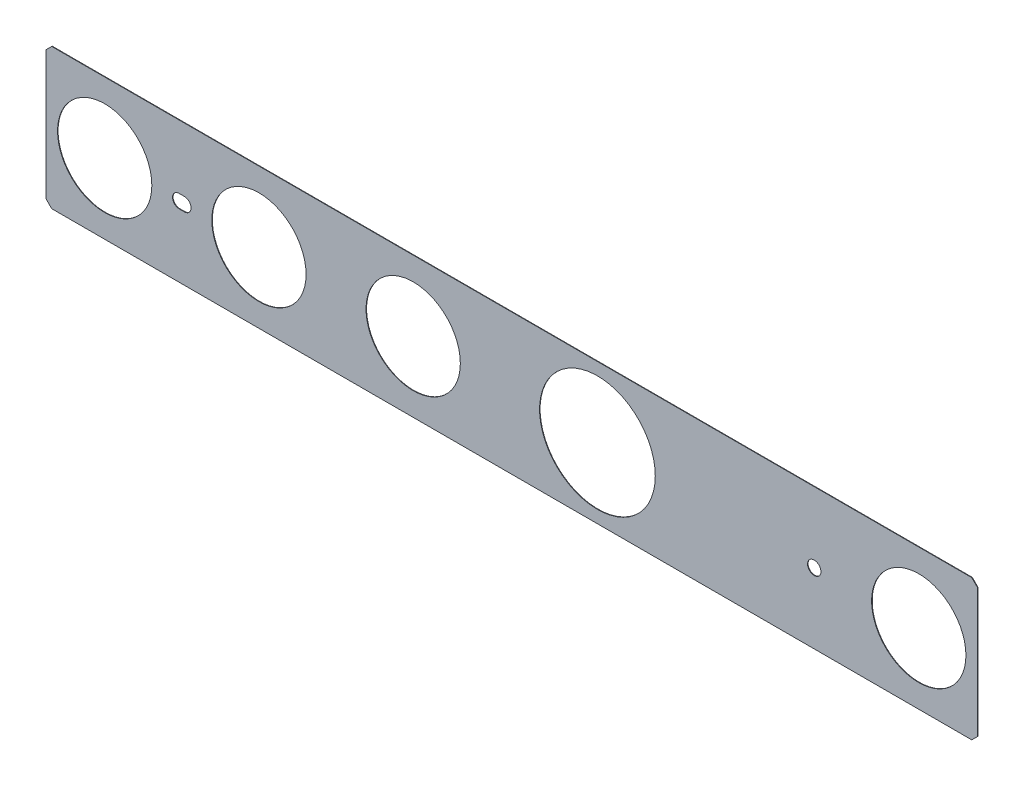
ISO-10303-21;
HEADER;
FILE_DESCRIPTION(('STEP AP214'),'2;1');
FILE_NAME('part.step','',(''),(''),'','','');
FILE_SCHEMA(('AUTOMOTIVE_DESIGN { 1 0 10303 214 1 1 1 1 }'));
ENDSEC;
DATA;
#1=APPLICATION_CONTEXT('core data for automotive mechanical design processes');
#2=APPLICATION_PROTOCOL_DEFINITION('international standard','automotive_design',2000,#1);
#3=PRODUCT_CONTEXT('',#1,'mechanical');
#4=PRODUCT('Part','Part','',(#3));
#5=PRODUCT_RELATED_PRODUCT_CATEGORY('part','',(#4));
#6=PRODUCT_DEFINITION_FORMATION('','',#4);
#7=PRODUCT_DEFINITION_CONTEXT('part definition',#1,'design');
#8=PRODUCT_DEFINITION('design','',#6,#7);
#9=PRODUCT_DEFINITION_SHAPE('','',#8);
#10=(LENGTH_UNIT() NAMED_UNIT(*) SI_UNIT(.MILLI.,.METRE.));
#11=(NAMED_UNIT(*) PLANE_ANGLE_UNIT() SI_UNIT($,.RADIAN.));
#12=(NAMED_UNIT(*) SI_UNIT($,.STERADIAN.) SOLID_ANGLE_UNIT());
#13=UNCERTAINTY_MEASURE_WITH_UNIT(LENGTH_MEASURE(1.E-05),#10,'distance_accuracy_value','');
#14=(GEOMETRIC_REPRESENTATION_CONTEXT(3) GLOBAL_UNCERTAINTY_ASSIGNED_CONTEXT((#13)) GLOBAL_UNIT_ASSIGNED_CONTEXT((#10,
#11,#12)) REPRESENTATION_CONTEXT('',''));
#15=CARTESIAN_POINT('',(0.,0.,0.));
#16=DIRECTION('',(0.,0.,1.));
#17=DIRECTION('',(1.,0.,0.));
#18=AXIS2_PLACEMENT_3D('',#15,#16,#17);
#19=CARTESIAN_POINT('',(0.,0.,-2.47));
#20=DIRECTION('',(0.,0.,1.));
#21=DIRECTION('',(1.,0.,0.));
#22=AXIS2_PLACEMENT_3D('',#19,#20,#21);
#23=PLANE('',#22);
#24=DIRECTION('',(1.,0.,0.));
#25=VECTOR('',#24,1.);
#26=CARTESIAN_POINT('',(-38.8,-0.78,-2.47));
#27=LINE('',#26,#25);
#28=CARTESIAN_POINT('',(-38.8,-0.78,-2.47));
#29=VERTEX_POINT('',#28);
#30=CARTESIAN_POINT('',(-38.2,-0.78,-2.47));
#31=VERTEX_POINT('',#30);
#32=EDGE_CURVE('E127',#29,#31,#27,.T.);
#33=ORIENTED_EDGE('',*,*,#32,.T.);
#34=CARTESIAN_POINT('',(-38.2,0.,-2.47));
#35=DIRECTION('',(0.,0.,1.));
#36=DIRECTION('',(1.,0.,0.));
#37=AXIS2_PLACEMENT_3D('',#34,#35,#36);
#38=CIRCLE('',#37,0.78);
#39=CARTESIAN_POINT('',(-38.2,0.78,-2.47));
#40=VERTEX_POINT('',#39);
#41=EDGE_CURVE('E59',#31,#40,#38,.T.);
#42=ORIENTED_EDGE('',*,*,#41,.T.);
#43=DIRECTION('',(1.,0.,0.));
#44=VECTOR('',#43,1.);
#45=CARTESIAN_POINT('',(-38.2,0.78,-2.47));
#46=LINE('',#45,#44);
#47=CARTESIAN_POINT('',(-38.8,0.78,-2.47));
#48=VERTEX_POINT('',#47);
#49=EDGE_CURVE('E124',#40,#48,#46,.F.);
#50=ORIENTED_EDGE('',*,*,#49,.T.);
#51=CARTESIAN_POINT('',(-38.8,0.,-2.47));
#52=DIRECTION('',(0.,0.,1.));
#53=DIRECTION('',(1.,0.,0.));
#54=AXIS2_PLACEMENT_3D('',#51,#52,#53);
#55=CIRCLE('',#54,0.78);
#56=EDGE_CURVE('E153',#48,#29,#55,.T.);
#57=ORIENTED_EDGE('',*,*,#56,.T.);
#58=EDGE_LOOP('',(#33,#42,#50,#57));
#59=FACE_BOUND('',#58,.T.);
#60=CARTESIAN_POINT('',(35.3,0.,-2.47));
#61=DIRECTION('',(0.,0.,1.));
#62=DIRECTION('',(1.,0.,0.));
#63=AXIS2_PLACEMENT_3D('',#60,#61,#62);
#64=CIRCLE('',#63,0.78);
#65=CARTESIAN_POINT('',(36.08,0.,-2.47));
#66=VERTEX_POINT('',#65);
#67=EDGE_CURVE('E126',#66,#66,#64,.T.);
#68=ORIENTED_EDGE('',*,*,#67,.T.);
#69=EDGE_LOOP('',(#68));
#70=FACE_BOUND('',#69,.T.);
#71=CARTESIAN_POINT('',(47.5,0.,-2.47));
#72=DIRECTION('',(0.,0.,1.));
#73=DIRECTION('',(1.,0.,0.));
#74=AXIS2_PLACEMENT_3D('',#71,#72,#73);
#75=CIRCLE('',#74,5.5);
#76=CARTESIAN_POINT('',(53.,0.,-2.47));
#77=VERTEX_POINT('',#76);
#78=EDGE_CURVE('E158',#77,#77,#75,.T.);
#79=ORIENTED_EDGE('',*,*,#78,.T.);
#80=EDGE_LOOP('',(#79));
#81=FACE_BOUND('',#80,.T.);
#82=CARTESIAN_POINT('',(-47.5,0.,-2.47));
#83=DIRECTION('',(0.,0.,1.));
#84=DIRECTION('',(1.,0.,0.));
#85=AXIS2_PLACEMENT_3D('',#82,#83,#84);
#86=CIRCLE('',#85,5.5);
#87=CARTESIAN_POINT('',(-42.,0.,-2.47));
#88=VERTEX_POINT('',#87);
#89=EDGE_CURVE('E161',#88,#88,#86,.T.);
#90=ORIENTED_EDGE('',*,*,#89,.T.);
#91=EDGE_LOOP('',(#90));
#92=FACE_BOUND('',#91,.T.);
#93=CARTESIAN_POINT('',(-11.5,0.,-2.47));
#94=DIRECTION('',(0.,0.,1.));
#95=DIRECTION('',(1.,0.,0.));
#96=AXIS2_PLACEMENT_3D('',#93,#94,#95);
#97=CIRCLE('',#96,5.5);
#98=CARTESIAN_POINT('',(-6.,0.,-2.47));
#99=VERTEX_POINT('',#98);
#100=EDGE_CURVE('E164',#99,#99,#97,.T.);
#101=ORIENTED_EDGE('',*,*,#100,.T.);
#102=EDGE_LOOP('',(#101));
#103=FACE_BOUND('',#102,.T.);
#104=CARTESIAN_POINT('',(10.,0.,-2.47));
#105=DIRECTION('',(0.,0.,1.));
#106=DIRECTION('',(1.,0.,0.));
#107=AXIS2_PLACEMENT_3D('',#104,#105,#106);
#108=CIRCLE('',#107,6.75);
#109=CARTESIAN_POINT('',(16.75,0.,-2.47));
#110=VERTEX_POINT('',#109);
#111=EDGE_CURVE('E166',#110,#110,#108,.T.);
#112=ORIENTED_EDGE('',*,*,#111,.T.);
#113=EDGE_LOOP('',(#112));
#114=FACE_BOUND('',#113,.T.);
#115=CARTESIAN_POINT('',(-29.5,0.,-2.47));
#116=DIRECTION('',(0.,0.,1.));
#117=DIRECTION('',(1.,0.,0.));
#118=AXIS2_PLACEMENT_3D('',#115,#116,#117);
#119=CIRCLE('',#118,5.5);
#120=CARTESIAN_POINT('',(-24.,0.,-2.47));
#121=VERTEX_POINT('',#120);
#122=EDGE_CURVE('E20',#121,#121,#119,.T.);
#123=ORIENTED_EDGE('',*,*,#122,.T.);
#124=EDGE_LOOP('',(#123));
#125=FACE_BOUND('',#124,.T.);
#126=DIRECTION('',(0.,1.,0.));
#127=VECTOR('',#126,1.);
#128=CARTESIAN_POINT('',(54.35,-7.532893218813,-2.47));
#129=LINE('',#128,#127);
#130=CARTESIAN_POINT('',(54.3499999999993,-7.53289321881225,-2.47));
#131=VERTEX_POINT('',#130);
#132=CARTESIAN_POINT('',(54.3500000000001,7.53289321881213,-2.47));
#133=VERTEX_POINT('',#132);
#134=EDGE_CURVE('E186',#131,#133,#129,.T.);
#135=ORIENTED_EDGE('',*,*,#134,.F.);
#136=DIRECTION('',(0.707106781186548,0.707106781186548,0.));
#137=VECTOR('',#136,1.);
#138=CARTESIAN_POINT('',(53.68289321881,-8.2,-2.47));
#139=LINE('',#138,#137);
#140=CARTESIAN_POINT('',(53.68289321881,-8.2,-2.47));
#141=VERTEX_POINT('',#140);
#142=EDGE_CURVE('E191',#141,#131,#139,.T.);
#143=ORIENTED_EDGE('',*,*,#142,.F.);
#144=DIRECTION('',(1.,0.,0.));
#145=VECTOR('',#144,1.);
#146=CARTESIAN_POINT('',(-53.68289321881,-8.2,-2.47));
#147=LINE('',#146,#145);
#148=CARTESIAN_POINT('',(-53.6828932188107,-8.20000000000075,-2.47));
#149=VERTEX_POINT('',#148);
#150=EDGE_CURVE('E196',#149,#141,#147,.T.);
#151=ORIENTED_EDGE('',*,*,#150,.F.);
#152=DIRECTION('',(0.707106781186548,-0.707106781186548,0.));
#153=VECTOR('',#152,1.);
#154=CARTESIAN_POINT('',(-54.35,-7.532893218813,-2.47));
#155=LINE('',#154,#153);
#156=CARTESIAN_POINT('',(-54.3500000000001,-7.53289321881213,-2.47));
#157=VERTEX_POINT('',#156);
#158=EDGE_CURVE('E111',#157,#149,#155,.T.);
#159=ORIENTED_EDGE('',*,*,#158,.F.);
#160=DIRECTION('',(0.,1.,0.));
#161=VECTOR('',#160,1.);
#162=CARTESIAN_POINT('',(-54.35,7.532893218813,-2.47));
#163=LINE('',#162,#161);
#164=CARTESIAN_POINT('',(-54.3499999999993,7.53289321881225,-2.47));
#165=VERTEX_POINT('',#164);
#166=EDGE_CURVE('E108',#165,#157,#163,.F.);
#167=ORIENTED_EDGE('',*,*,#166,.F.);
#168=DIRECTION('',(-0.707106781186548,-0.707106781186548,0.));
#169=VECTOR('',#168,1.);
#170=CARTESIAN_POINT('',(-53.68289321881,8.2,-2.47));
#171=LINE('',#170,#169);
#172=CARTESIAN_POINT('',(-53.68289321881,8.2,-2.47));
#173=VERTEX_POINT('',#172);
#174=EDGE_CURVE('E95',#173,#165,#171,.T.);
#175=ORIENTED_EDGE('',*,*,#174,.F.);
#176=DIRECTION('',(1.,0.,0.));
#177=VECTOR('',#176,1.);
#178=CARTESIAN_POINT('',(53.68289321881,8.2,-2.47));
#179=LINE('',#178,#177);
#180=CARTESIAN_POINT('',(53.6828932188108,8.20000000000075,-2.47));
#181=VERTEX_POINT('',#180);
#182=EDGE_CURVE('E171',#181,#173,#179,.F.);
#183=ORIENTED_EDGE('',*,*,#182,.F.);
#184=DIRECTION('',(-0.707106781186548,0.707106781186548,0.));
#185=VECTOR('',#184,1.);
#186=CARTESIAN_POINT('',(54.35,7.532893218813,-2.47));
#187=LINE('',#186,#185);
#188=EDGE_CURVE('E68',#133,#181,#187,.T.);
#189=ORIENTED_EDGE('',*,*,#188,.F.);
#190=EDGE_LOOP('',(#135,#143,#151,#159,#167,#175,#183,#189));
#191=FACE_BOUND('',#190,.T.);
#192=ADVANCED_FACE('F17',(#59,#70,#81,#92,#103,#114,#125,#191),#23,.F.);
#193=CARTESIAN_POINT('',(-53.68289321881,8.2,-2.47));
#194=DIRECTION('',(-0.707106781186548,0.707106781186548,0.));
#195=DIRECTION('',(-0.707106781186548,-0.707106781186548,0.));
#196=AXIS2_PLACEMENT_3D('',#193,#194,#195);
#197=PLANE('',#196);
#198=DIRECTION('',(0.,0.,1.));
#199=VECTOR('',#198,1.);
#200=CARTESIAN_POINT('',(-53.68289321881,8.2,-2.47));
#201=LINE('',#200,#199);
#202=CARTESIAN_POINT('',(-53.68289321881,8.2,-2.41));
#203=VERTEX_POINT('',#202);
#204=EDGE_CURVE('E103',#173,#203,#201,.T.);
#205=ORIENTED_EDGE('',*,*,#204,.F.);
#206=ORIENTED_EDGE('',*,*,#174,.T.);
#207=DIRECTION('',(0.,0.,1.));
#208=VECTOR('',#207,1.);
#209=CARTESIAN_POINT('',(-54.35,7.532893218813,-2.47));
#210=LINE('',#209,#208);
#211=CARTESIAN_POINT('',(-54.3499999999993,7.53289321881225,-2.41));
#212=VERTEX_POINT('',#211);
#213=EDGE_CURVE('E100',#212,#165,#210,.F.);
#214=ORIENTED_EDGE('',*,*,#213,.F.);
#215=DIRECTION('',(-0.707106781188139,-0.707106781184956,0.));
#216=VECTOR('',#215,1.);
#217=CARTESIAN_POINT('',(-53.68289321881,8.2,-2.41));
#218=LINE('',#217,#216);
#219=EDGE_CURVE('E213',#203,#212,#218,.T.);
#220=ORIENTED_EDGE('',*,*,#219,.F.);
#221=EDGE_LOOP('',(#205,#206,#214,#220));
#222=FACE_BOUND('',#221,.T.);
#223=ADVANCED_FACE('F97',(#222),#197,.T.);
#224=CARTESIAN_POINT('',(-54.35,7.532893218813,-2.47));
#225=DIRECTION('',(-1.,0.,0.));
#226=DIRECTION('',(0.,0.,1.));
#227=AXIS2_PLACEMENT_3D('',#224,#225,#226);
#228=PLANE('',#227);
#229=ORIENTED_EDGE('',*,*,#213,.T.);
#230=ORIENTED_EDGE('',*,*,#166,.T.);
#231=DIRECTION('',(0.,0.,1.));
#232=VECTOR('',#231,1.);
#233=CARTESIAN_POINT('',(-54.3500000000005,-7.5328932188125,-2.47));
#234=LINE('',#233,#232);
#235=CARTESIAN_POINT('',(-54.3500000000001,-7.53289321881213,-2.41));
#236=VERTEX_POINT('',#235);
#237=EDGE_CURVE('E115',#236,#157,#234,.F.);
#238=ORIENTED_EDGE('',*,*,#237,.F.);
#239=DIRECTION('',(0.,1.,0.));
#240=VECTOR('',#239,1.);
#241=CARTESIAN_POINT('',(-54.35,0.,-2.41));
#242=LINE('',#241,#240);
#243=EDGE_CURVE('E119',#212,#236,#242,.F.);
#244=ORIENTED_EDGE('',*,*,#243,.F.);
#245=EDGE_LOOP('',(#229,#230,#238,#244));
#246=FACE_BOUND('',#245,.T.);
#247=ADVANCED_FACE('F117',(#246),#228,.T.);
#248=CARTESIAN_POINT('',(-54.35,-7.532893218813,-2.47));
#249=DIRECTION('',(-0.707106781186548,-0.707106781186548,0.));
#250=DIRECTION('',(0.707106781186548,-0.707106781186548,0.));
#251=AXIS2_PLACEMENT_3D('',#248,#249,#250);
#252=PLANE('',#251);
#253=ORIENTED_EDGE('',*,*,#237,.T.);
#254=ORIENTED_EDGE('',*,*,#158,.T.);
#255=DIRECTION('',(0.,0.,-1.));
#256=VECTOR('',#255,1.);
#257=CARTESIAN_POINT('',(-53.68289321881,-8.2,-2.47));
#258=LINE('',#257,#256);
#259=CARTESIAN_POINT('',(-53.6828932188107,-8.20000000000075,-2.41));
#260=VERTEX_POINT('',#259);
#261=EDGE_CURVE('E198',#260,#149,#258,.T.);
#262=ORIENTED_EDGE('',*,*,#261,.F.);
#263=DIRECTION('',(0.707106781187609,-0.707106781185486,0.));
#264=VECTOR('',#263,1.);
#265=CARTESIAN_POINT('',(-54.35,-7.532893218812,-2.41));
#266=LINE('',#265,#264);
#267=EDGE_CURVE('E207',#236,#260,#266,.T.);
#268=ORIENTED_EDGE('',*,*,#267,.F.);
#269=EDGE_LOOP('',(#253,#254,#262,#268));
#270=FACE_BOUND('',#269,.T.);
#271=ADVANCED_FACE('F203',(#270),#252,.T.);
#272=CARTESIAN_POINT('',(-53.68289321881,-8.2,-2.47));
#273=DIRECTION('',(0.,-1.,0.));
#274=DIRECTION('',(0.,0.,-1.));
#275=AXIS2_PLACEMENT_3D('',#272,#273,#274);
#276=PLANE('',#275);
#277=ORIENTED_EDGE('',*,*,#261,.T.);
#278=ORIENTED_EDGE('',*,*,#150,.T.);
#279=DIRECTION('',(0.,0.,1.));
#280=VECTOR('',#279,1.);
#281=CARTESIAN_POINT('',(53.68289321881,-8.2,-2.47));
#282=LINE('',#281,#280);
#283=CARTESIAN_POINT('',(53.68289321881,-8.2,-2.41));
#284=VERTEX_POINT('',#283);
#285=EDGE_CURVE('E193',#284,#141,#282,.F.);
#286=ORIENTED_EDGE('',*,*,#285,.F.);
#287=DIRECTION('',(1.,0.,0.));
#288=VECTOR('',#287,1.);
#289=CARTESIAN_POINT('',(0.,-8.2,-2.41));
#290=LINE('',#289,#288);
#291=EDGE_CURVE('E236',#260,#284,#290,.T.);
#292=ORIENTED_EDGE('',*,*,#291,.F.);
#293=EDGE_LOOP('',(#277,#278,#286,#292));
#294=FACE_BOUND('',#293,.T.);
#295=ADVANCED_FACE('F338',(#294),#276,.T.);
#296=CARTESIAN_POINT('',(53.68289321881,-8.2,-2.47));
#297=DIRECTION('',(0.707106781186548,-0.707106781186548,0.));
#298=DIRECTION('',(0.707106781186548,0.707106781186548,0.));
#299=AXIS2_PLACEMENT_3D('',#296,#297,#298);
#300=PLANE('',#299);
#301=ORIENTED_EDGE('',*,*,#285,.T.);
#302=ORIENTED_EDGE('',*,*,#142,.T.);
#303=DIRECTION('',(0.,0.,-1.));
#304=VECTOR('',#303,1.);
#305=CARTESIAN_POINT('',(54.35,-7.532893218813,-2.47));
#306=LINE('',#305,#304);
#307=CARTESIAN_POINT('',(54.3499999999993,-7.53289321881225,-2.41));
#308=VERTEX_POINT('',#307);
#309=EDGE_CURVE('E188',#308,#131,#306,.T.);
#310=ORIENTED_EDGE('',*,*,#309,.F.);
#311=DIRECTION('',(0.707106781188139,0.707106781184956,0.));
#312=VECTOR('',#311,1.);
#313=CARTESIAN_POINT('',(53.68289321881,-8.2,-2.41));
#314=LINE('',#313,#312);
#315=EDGE_CURVE('E233',#284,#308,#314,.T.);
#316=ORIENTED_EDGE('',*,*,#315,.F.);
#317=EDGE_LOOP('',(#301,#302,#310,#316));
#318=FACE_BOUND('',#317,.T.);
#319=ADVANCED_FACE('F334',(#318),#300,.T.);
#320=CARTESIAN_POINT('',(54.35,-7.532893218813,-2.47));
#321=DIRECTION('',(1.,0.,0.));
#322=DIRECTION('',(0.,0.,-1.));
#323=AXIS2_PLACEMENT_3D('',#320,#321,#322);
#324=PLANE('',#323);
#325=ORIENTED_EDGE('',*,*,#309,.T.);
#326=ORIENTED_EDGE('',*,*,#134,.T.);
#327=DIRECTION('',(0.,0.,1.));
#328=VECTOR('',#327,1.);
#329=CARTESIAN_POINT('',(54.3500000000005,7.5328932188125,-2.47));
#330=LINE('',#329,#328);
#331=CARTESIAN_POINT('',(54.3500000000001,7.53289321881213,-2.41));
#332=VERTEX_POINT('',#331);
#333=EDGE_CURVE('E184',#332,#133,#330,.F.);
#334=ORIENTED_EDGE('',*,*,#333,.F.);
#335=DIRECTION('',(0.,1.,0.));
#336=VECTOR('',#335,1.);
#337=CARTESIAN_POINT('',(54.35,0.,-2.41));
#338=LINE('',#337,#336);
#339=EDGE_CURVE('E227',#308,#332,#338,.T.);
#340=ORIENTED_EDGE('',*,*,#339,.F.);
#341=EDGE_LOOP('',(#325,#326,#334,#340));
#342=FACE_BOUND('',#341,.T.);
#343=ADVANCED_FACE('F331',(#342),#324,.T.);
#344=CARTESIAN_POINT('',(54.35,7.532893218813,-2.47));
#345=DIRECTION('',(0.707106781186548,0.707106781186548,0.));
#346=DIRECTION('',(-0.707106781186548,0.707106781186548,0.));
#347=AXIS2_PLACEMENT_3D('',#344,#345,#346);
#348=PLANE('',#347);
#349=ORIENTED_EDGE('',*,*,#333,.T.);
#350=ORIENTED_EDGE('',*,*,#188,.T.);
#351=DIRECTION('',(0.,0.,1.));
#352=VECTOR('',#351,1.);
#353=CARTESIAN_POINT('',(53.68289321881,8.2,-2.47));
#354=LINE('',#353,#352);
#355=CARTESIAN_POINT('',(53.6828932188107,8.20000000000075,-2.41));
#356=VERTEX_POINT('',#355);
#357=EDGE_CURVE('E174',#356,#181,#354,.F.);
#358=ORIENTED_EDGE('',*,*,#357,.F.);
#359=DIRECTION('',(-0.707106781187609,0.707106781185486,0.));
#360=VECTOR('',#359,1.);
#361=CARTESIAN_POINT('',(54.35,7.532893218812,-2.41));
#362=LINE('',#361,#360);
#363=EDGE_CURVE('E225',#332,#356,#362,.T.);
#364=ORIENTED_EDGE('',*,*,#363,.F.);
#365=EDGE_LOOP('',(#349,#350,#358,#364));
#366=FACE_BOUND('',#365,.T.);
#367=ADVANCED_FACE('F326',(#366),#348,.T.);
#368=CARTESIAN_POINT('',(53.68289321881,8.2,-2.47));
#369=DIRECTION('',(0.,1.,0.));
#370=DIRECTION('',(0.,0.,1.));
#371=AXIS2_PLACEMENT_3D('',#368,#369,#370);
#372=PLANE('',#371);
#373=ORIENTED_EDGE('',*,*,#357,.T.);
#374=ORIENTED_EDGE('',*,*,#182,.T.);
#375=ORIENTED_EDGE('',*,*,#204,.T.);
#376=DIRECTION('',(1.,0.,0.));
#377=VECTOR('',#376,1.);
#378=CARTESIAN_POINT('',(0.,8.2,-2.41));
#379=LINE('',#378,#377);
#380=EDGE_CURVE('E152',#356,#203,#379,.F.);
#381=ORIENTED_EDGE('',*,*,#380,.F.);
#382=EDGE_LOOP('',(#373,#374,#375,#381));
#383=FACE_BOUND('',#382,.T.);
#384=ADVANCED_FACE('F219',(#383),#372,.T.);
#385=CARTESIAN_POINT('',(-29.5,0.,-2.47));
#386=DIRECTION('',(0.,0.,1.));
#387=DIRECTION('',(1.,0.,0.));
#388=AXIS2_PLACEMENT_3D('',#385,#386,#387);
#389=CYLINDRICAL_SURFACE('',#388,5.5);
#390=CARTESIAN_POINT('',(-29.5,0.,-2.41));
#391=DIRECTION('',(0.,0.,1.));
#392=DIRECTION('',(1.,0.,0.));
#393=AXIS2_PLACEMENT_3D('',#390,#391,#392);
#394=CIRCLE('',#393,5.5);
#395=CARTESIAN_POINT('',(-24.,0.,-2.41));
#396=VERTEX_POINT('',#395);
#397=EDGE_CURVE('E149',#396,#396,#394,.F.);
#398=ORIENTED_EDGE('',*,*,#397,.F.);
#399=EDGE_LOOP('',(#398));
#400=FACE_BOUND('',#399,.T.);
#401=ORIENTED_EDGE('',*,*,#122,.F.);
#402=EDGE_LOOP('',(#401));
#403=FACE_BOUND('',#402,.T.);
#404=ADVANCED_FACE('F284',(#400,#403),#389,.F.);
#405=CARTESIAN_POINT('',(10.,0.,-2.47));
#406=DIRECTION('',(0.,0.,1.));
#407=DIRECTION('',(1.,0.,0.));
#408=AXIS2_PLACEMENT_3D('',#405,#406,#407);
#409=CYLINDRICAL_SURFACE('',#408,6.75);
#410=CARTESIAN_POINT('',(10.,0.,-2.41));
#411=DIRECTION('',(0.,0.,1.));
#412=DIRECTION('',(1.,0.,0.));
#413=AXIS2_PLACEMENT_3D('',#410,#411,#412);
#414=CIRCLE('',#413,6.75);
#415=CARTESIAN_POINT('',(16.75,0.,-2.41));
#416=VERTEX_POINT('',#415);
#417=EDGE_CURVE('E146',#416,#416,#414,.F.);
#418=ORIENTED_EDGE('',*,*,#417,.F.);
#419=EDGE_LOOP('',(#418));
#420=FACE_BOUND('',#419,.T.);
#421=ORIENTED_EDGE('',*,*,#111,.F.);
#422=EDGE_LOOP('',(#421));
#423=FACE_BOUND('',#422,.T.);
#424=ADVANCED_FACE('F273',(#420,#423),#409,.F.);
#425=CARTESIAN_POINT('',(-11.5,0.,-2.47));
#426=DIRECTION('',(0.,0.,1.));
#427=DIRECTION('',(1.,0.,0.));
#428=AXIS2_PLACEMENT_3D('',#425,#426,#427);
#429=CYLINDRICAL_SURFACE('',#428,5.5);
#430=CARTESIAN_POINT('',(-11.5,0.,-2.41));
#431=DIRECTION('',(0.,0.,1.));
#432=DIRECTION('',(1.,0.,0.));
#433=AXIS2_PLACEMENT_3D('',#430,#431,#432);
#434=CIRCLE('',#433,5.5);
#435=CARTESIAN_POINT('',(-6.,0.,-2.41));
#436=VERTEX_POINT('',#435);
#437=EDGE_CURVE('E143',#436,#436,#434,.F.);
#438=ORIENTED_EDGE('',*,*,#437,.F.);
#439=EDGE_LOOP('',(#438));
#440=FACE_BOUND('',#439,.T.);
#441=ORIENTED_EDGE('',*,*,#100,.F.);
#442=EDGE_LOOP('',(#441));
#443=FACE_BOUND('',#442,.T.);
#444=ADVANCED_FACE('F270',(#440,#443),#429,.F.);
#445=CARTESIAN_POINT('',(-47.5,0.,-2.47));
#446=DIRECTION('',(0.,0.,1.));
#447=DIRECTION('',(1.,0.,0.));
#448=AXIS2_PLACEMENT_3D('',#445,#446,#447);
#449=CYLINDRICAL_SURFACE('',#448,5.5);
#450=CARTESIAN_POINT('',(-47.5,0.,-2.41));
#451=DIRECTION('',(0.,0.,1.));
#452=DIRECTION('',(1.,0.,0.));
#453=AXIS2_PLACEMENT_3D('',#450,#451,#452);
#454=CIRCLE('',#453,5.5);
#455=CARTESIAN_POINT('',(-42.,0.,-2.41));
#456=VERTEX_POINT('',#455);
#457=EDGE_CURVE('E140',#456,#456,#454,.F.);
#458=ORIENTED_EDGE('',*,*,#457,.F.);
#459=EDGE_LOOP('',(#458));
#460=FACE_BOUND('',#459,.T.);
#461=ORIENTED_EDGE('',*,*,#89,.F.);
#462=EDGE_LOOP('',(#461));
#463=FACE_BOUND('',#462,.T.);
#464=ADVANCED_FACE('F272',(#460,#463),#449,.F.);
#465=CARTESIAN_POINT('',(47.5,0.,-2.47));
#466=DIRECTION('',(0.,0.,1.));
#467=DIRECTION('',(1.,0.,0.));
#468=AXIS2_PLACEMENT_3D('',#465,#466,#467);
#469=CYLINDRICAL_SURFACE('',#468,5.5);
#470=CARTESIAN_POINT('',(47.5,0.,-2.41));
#471=DIRECTION('',(0.,0.,1.));
#472=DIRECTION('',(1.,0.,0.));
#473=AXIS2_PLACEMENT_3D('',#470,#471,#472);
#474=CIRCLE('',#473,5.5);
#475=CARTESIAN_POINT('',(53.,0.,-2.41));
#476=VERTEX_POINT('',#475);
#477=EDGE_CURVE('E137',#476,#476,#474,.F.);
#478=ORIENTED_EDGE('',*,*,#477,.F.);
#479=EDGE_LOOP('',(#478));
#480=FACE_BOUND('',#479,.T.);
#481=ORIENTED_EDGE('',*,*,#78,.F.);
#482=EDGE_LOOP('',(#481));
#483=FACE_BOUND('',#482,.T.);
#484=ADVANCED_FACE('F281',(#480,#483),#469,.F.);
#485=CARTESIAN_POINT('',(35.3,0.,-2.41));
#486=DIRECTION('',(0.,0.,1.));
#487=DIRECTION('',(1.,0.,0.));
#488=AXIS2_PLACEMENT_3D('',#485,#486,#487);
#489=CYLINDRICAL_SURFACE('',#488,0.78);
#490=CARTESIAN_POINT('',(35.3,0.,-2.41));
#491=DIRECTION('',(0.,0.,1.));
#492=DIRECTION('',(1.,0.,0.));
#493=AXIS2_PLACEMENT_3D('',#490,#491,#492);
#494=CIRCLE('',#493,0.78);
#495=CARTESIAN_POINT('',(36.08,0.,-2.41));
#496=VERTEX_POINT('',#495);
#497=EDGE_CURVE('E134',#496,#496,#494,.F.);
#498=ORIENTED_EDGE('',*,*,#497,.F.);
#499=EDGE_LOOP('',(#498));
#500=FACE_BOUND('',#499,.T.);
#501=ORIENTED_EDGE('',*,*,#67,.F.);
#502=EDGE_LOOP('',(#501));
#503=FACE_BOUND('',#502,.T.);
#504=ADVANCED_FACE('F301',(#500,#503),#489,.F.);
#505=CARTESIAN_POINT('',(-38.2,0.78,-2.41));
#506=DIRECTION('',(0.,1.,0.));
#507=DIRECTION('',(0.,0.,1.));
#508=AXIS2_PLACEMENT_3D('',#505,#506,#507);
#509=PLANE('',#508);
#510=DIRECTION('',(1.,0.,0.));
#511=VECTOR('',#510,1.);
#512=CARTESIAN_POINT('',(0.,0.78,-2.41));
#513=LINE('',#512,#511);
#514=CARTESIAN_POINT('',(-38.8,0.78,-2.41));
#515=VERTEX_POINT('',#514);
#516=CARTESIAN_POINT('',(-38.2,0.78,-2.41));
#517=VERTEX_POINT('',#516);
#518=EDGE_CURVE('E133',#515,#517,#513,.T.);
#519=ORIENTED_EDGE('',*,*,#518,.F.);
#520=DIRECTION('',(0.,0.,1.));
#521=VECTOR('',#520,1.);
#522=CARTESIAN_POINT('',(-38.8,0.78,-2.41));
#523=LINE('',#522,#521);
#524=EDGE_CURVE('E216',#515,#48,#523,.F.);
#525=ORIENTED_EDGE('',*,*,#524,.T.);
#526=ORIENTED_EDGE('',*,*,#49,.F.);
#527=DIRECTION('',(0.,0.,1.));
#528=VECTOR('',#527,1.);
#529=CARTESIAN_POINT('',(-38.2,0.78,-2.41));
#530=LINE('',#529,#528);
#531=EDGE_CURVE('E129',#40,#517,#530,.T.);
#532=ORIENTED_EDGE('',*,*,#531,.T.);
#533=EDGE_LOOP('',(#519,#525,#526,#532));
#534=FACE_BOUND('',#533,.T.);
#535=ADVANCED_FACE('F257',(#534),#509,.F.);
#536=CARTESIAN_POINT('',(-38.2,0.,-2.41));
#537=DIRECTION('',(0.,0.,1.));
#538=DIRECTION('',(1.,0.,0.));
#539=AXIS2_PLACEMENT_3D('',#536,#537,#538);
#540=CYLINDRICAL_SURFACE('',#539,0.78);
#541=DIRECTION('',(0.,0.,-1.));
#542=VECTOR('',#541,1.);
#543=CARTESIAN_POINT('',(-38.2,-0.78,-2.41));
#544=LINE('',#543,#542);
#545=CARTESIAN_POINT('',(-38.2,-0.78,-2.41));
#546=VERTEX_POINT('',#545);
#547=EDGE_CURVE('E128',#31,#546,#544,.F.);
#548=ORIENTED_EDGE('',*,*,#547,.T.);
#549=CARTESIAN_POINT('',(-38.2,0.,-2.41));
#550=DIRECTION('',(0.,0.,1.));
#551=DIRECTION('',(1.,0.,0.));
#552=AXIS2_PLACEMENT_3D('',#549,#550,#551);
#553=CIRCLE('',#552,0.78);
#554=EDGE_CURVE('E131',#517,#546,#553,.F.);
#555=ORIENTED_EDGE('',*,*,#554,.F.);
#556=ORIENTED_EDGE('',*,*,#531,.F.);
#557=ORIENTED_EDGE('',*,*,#41,.F.);
#558=EDGE_LOOP('',(#548,#555,#556,#557));
#559=FACE_BOUND('',#558,.T.);
#560=ADVANCED_FACE('F247',(#559),#540,.F.);
#561=CARTESIAN_POINT('',(-38.8,-0.78,-2.41));
#562=DIRECTION('',(0.,-1.,0.));
#563=DIRECTION('',(0.,0.,-1.));
#564=AXIS2_PLACEMENT_3D('',#561,#562,#563);
#565=PLANE('',#564);
#566=DIRECTION('',(1.,0.,0.));
#567=VECTOR('',#566,1.);
#568=CARTESIAN_POINT('',(0.,-0.78,-2.41));
#569=LINE('',#568,#567);
#570=CARTESIAN_POINT('',(-38.8,-0.78,-2.41));
#571=VERTEX_POINT('',#570);
#572=EDGE_CURVE('E26',#546,#571,#569,.F.);
#573=ORIENTED_EDGE('',*,*,#572,.F.);
#574=ORIENTED_EDGE('',*,*,#547,.F.);
#575=ORIENTED_EDGE('',*,*,#32,.F.);
#576=DIRECTION('',(0.,0.,1.));
#577=VECTOR('',#576,1.);
#578=CARTESIAN_POINT('',(-38.8,-0.78,-2.41));
#579=LINE('',#578,#577);
#580=EDGE_CURVE('E35',#29,#571,#579,.T.);
#581=ORIENTED_EDGE('',*,*,#580,.T.);
#582=EDGE_LOOP('',(#573,#574,#575,#581));
#583=FACE_BOUND('',#582,.T.);
#584=ADVANCED_FACE('F251',(#583),#565,.F.);
#585=CARTESIAN_POINT('',(-38.8,0.,-2.41));
#586=DIRECTION('',(0.,0.,1.));
#587=DIRECTION('',(1.,0.,0.));
#588=AXIS2_PLACEMENT_3D('',#585,#586,#587);
#589=CYLINDRICAL_SURFACE('',#588,0.78);
#590=ORIENTED_EDGE('',*,*,#524,.F.);
#591=CARTESIAN_POINT('',(-38.8,0.,-2.41));
#592=DIRECTION('',(0.,0.,1.));
#593=DIRECTION('',(1.,0.,0.));
#594=AXIS2_PLACEMENT_3D('',#591,#592,#593);
#595=CIRCLE('',#594,0.78);
#596=EDGE_CURVE('E11',#571,#515,#595,.F.);
#597=ORIENTED_EDGE('',*,*,#596,.F.);
#598=ORIENTED_EDGE('',*,*,#580,.F.);
#599=ORIENTED_EDGE('',*,*,#56,.F.);
#600=EDGE_LOOP('',(#590,#597,#598,#599));
#601=FACE_BOUND('',#600,.T.);
#602=ADVANCED_FACE('F259',(#601),#589,.F.);
#603=CARTESIAN_POINT('',(0.,0.,-2.41));
#604=DIRECTION('',(0.,0.,1.));
#605=DIRECTION('',(1.,0.,0.));
#606=AXIS2_PLACEMENT_3D('',#603,#604,#605);
#607=PLANE('',#606);
#608=ORIENTED_EDGE('',*,*,#596,.T.);
#609=ORIENTED_EDGE('',*,*,#518,.T.);
#610=ORIENTED_EDGE('',*,*,#554,.T.);
#611=ORIENTED_EDGE('',*,*,#572,.T.);
#612=EDGE_LOOP('',(#608,#609,#610,#611));
#613=FACE_BOUND('',#612,.T.);
#614=ORIENTED_EDGE('',*,*,#497,.T.);
#615=EDGE_LOOP('',(#614));
#616=FACE_BOUND('',#615,.T.);
#617=ORIENTED_EDGE('',*,*,#477,.T.);
#618=EDGE_LOOP('',(#617));
#619=FACE_BOUND('',#618,.T.);
#620=ORIENTED_EDGE('',*,*,#457,.T.);
#621=EDGE_LOOP('',(#620));
#622=FACE_BOUND('',#621,.T.);
#623=ORIENTED_EDGE('',*,*,#437,.T.);
#624=EDGE_LOOP('',(#623));
#625=FACE_BOUND('',#624,.T.);
#626=ORIENTED_EDGE('',*,*,#417,.T.);
#627=EDGE_LOOP('',(#626));
#628=FACE_BOUND('',#627,.T.);
#629=ORIENTED_EDGE('',*,*,#397,.T.);
#630=EDGE_LOOP('',(#629));
#631=FACE_BOUND('',#630,.T.);
#632=ORIENTED_EDGE('',*,*,#363,.T.);
#633=ORIENTED_EDGE('',*,*,#380,.T.);
#634=ORIENTED_EDGE('',*,*,#219,.T.);
#635=ORIENTED_EDGE('',*,*,#243,.T.);
#636=ORIENTED_EDGE('',*,*,#267,.T.);
#637=ORIENTED_EDGE('',*,*,#291,.T.);
#638=ORIENTED_EDGE('',*,*,#315,.T.);
#639=ORIENTED_EDGE('',*,*,#339,.T.);
#640=EDGE_LOOP('',(#632,#633,#634,#635,#636,#637,#638,#639));
#641=FACE_BOUND('',#640,.T.);
#642=ADVANCED_FACE('F222',(#613,#616,#619,#622,#625,#628,#631,#641),#607,.T.);
#643=CLOSED_SHELL('',(#192,#223,#247,#271,#295,#319,#343,#367,#384,#404,#424,#444,#464,#484,
#504,#535,#560,#584,#602,#642));
#644=MANIFOLD_SOLID_BREP('B1',#643);
#645=ADVANCED_BREP_SHAPE_REPRESENTATION('',(#18,#644),#14);
#646=SHAPE_DEFINITION_REPRESENTATION(#9,#645);
ENDSEC;
END-ISO-10303-21;
